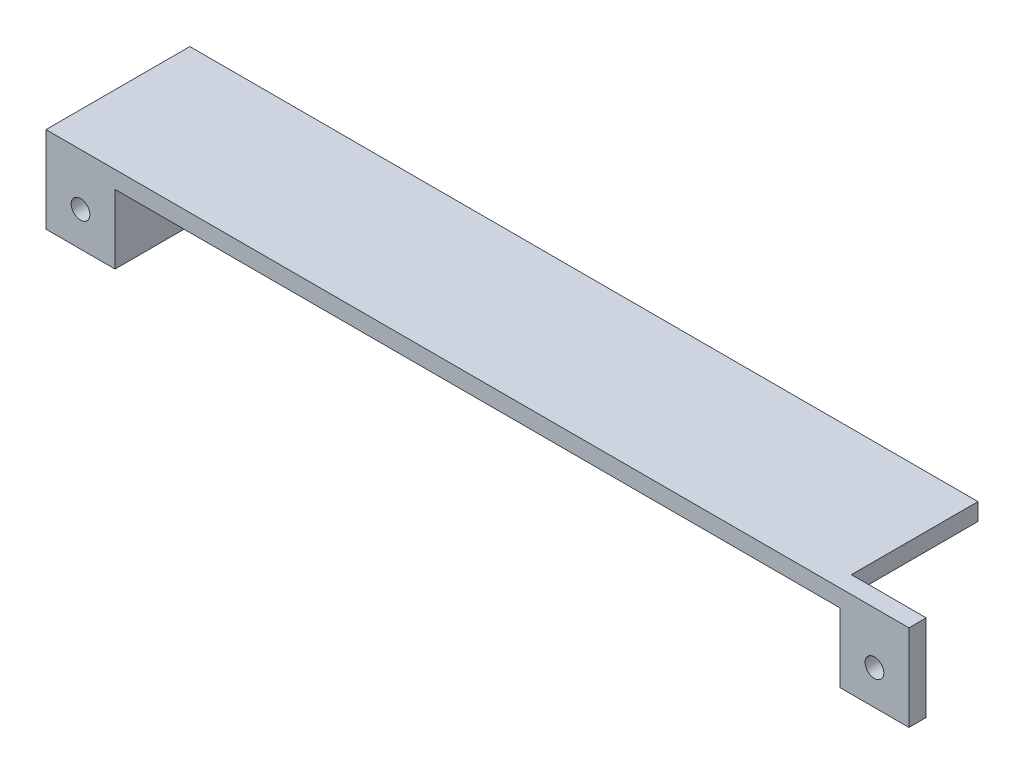
ISO-10303-21;
HEADER;
FILE_DESCRIPTION(('STEP AP214'),'2;1');
FILE_NAME('part.step','',(''),(''),'','','');
FILE_SCHEMA(('AUTOMOTIVE_DESIGN { 1 0 10303 214 1 1 1 1 }'));
ENDSEC;
DATA;
#1=APPLICATION_CONTEXT('core data for automotive mechanical design processes');
#2=APPLICATION_PROTOCOL_DEFINITION('international standard','automotive_design',2000,#1);
#3=PRODUCT_CONTEXT('',#1,'mechanical');
#4=PRODUCT('Part','Part','',(#3));
#5=PRODUCT_RELATED_PRODUCT_CATEGORY('part','',(#4));
#6=PRODUCT_DEFINITION_FORMATION('','',#4);
#7=PRODUCT_DEFINITION_CONTEXT('part definition',#1,'design');
#8=PRODUCT_DEFINITION('design','',#6,#7);
#9=PRODUCT_DEFINITION_SHAPE('','',#8);
#10=(LENGTH_UNIT() NAMED_UNIT(*) SI_UNIT(.MILLI.,.METRE.));
#11=(NAMED_UNIT(*) PLANE_ANGLE_UNIT() SI_UNIT($,.RADIAN.));
#12=(NAMED_UNIT(*) SI_UNIT($,.STERADIAN.) SOLID_ANGLE_UNIT());
#13=UNCERTAINTY_MEASURE_WITH_UNIT(LENGTH_MEASURE(1.E-05),#10,'distance_accuracy_value','');
#14=(GEOMETRIC_REPRESENTATION_CONTEXT(3) GLOBAL_UNCERTAINTY_ASSIGNED_CONTEXT((#13)) GLOBAL_UNIT_ASSIGNED_CONTEXT((#10,
#11,#12)) REPRESENTATION_CONTEXT('',''));
#15=CARTESIAN_POINT('',(0.,0.,0.));
#16=DIRECTION('',(0.,0.,1.));
#17=DIRECTION('',(1.,0.,0.));
#18=AXIS2_PLACEMENT_3D('',#15,#16,#17);
#19=CARTESIAN_POINT('',(0.,0.,0.));
#20=DIRECTION('',(0.,-1.,0.));
#21=DIRECTION('',(0.,0.,-1.));
#22=AXIS2_PLACEMENT_3D('',#19,#20,#21);
#23=PLANE('',#22);
#24=DIRECTION('',(-1.,0.,0.));
#25=VECTOR('',#24,1.);
#26=CARTESIAN_POINT('',(0.,0.,-2.99999999999998));
#27=LINE('',#26,#25);
#28=CARTESIAN_POINT('',(138.,0.,-3.));
#29=VERTEX_POINT('',#28);
#30=CARTESIAN_POINT('',(137.,0.,-3.));
#31=VERTEX_POINT('',#30);
#32=EDGE_CURVE('E211',#29,#31,#27,.T.);
#33=ORIENTED_EDGE('',*,*,#32,.F.);
#34=DIRECTION('',(0.,0.,-1.));
#35=VECTOR('',#34,1.);
#36=CARTESIAN_POINT('',(138.,0.,0.));
#37=LINE('',#36,#35);
#38=CARTESIAN_POINT('',(138.,0.,0.));
#39=VERTEX_POINT('',#38);
#40=EDGE_CURVE('E172',#39,#29,#37,.T.);
#41=ORIENTED_EDGE('',*,*,#40,.F.);
#42=DIRECTION('',(1.,0.,0.));
#43=VECTOR('',#42,1.);
#44=CARTESIAN_POINT('',(0.,0.,0.));
#45=LINE('',#44,#43);
#46=CARTESIAN_POINT('',(12.,0.,0.));
#47=VERTEX_POINT('',#46);
#48=EDGE_CURVE('E147',#47,#39,#45,.T.);
#49=ORIENTED_EDGE('',*,*,#48,.F.);
#50=DIRECTION('',(0.,0.,1.));
#51=VECTOR('',#50,1.);
#52=CARTESIAN_POINT('',(12.,0.,0.));
#53=LINE('',#52,#51);
#54=CARTESIAN_POINT('',(12.,0.,-25.));
#55=VERTEX_POINT('',#54);
#56=EDGE_CURVE('E180',#55,#47,#53,.T.);
#57=ORIENTED_EDGE('',*,*,#56,.F.);
#58=DIRECTION('',(-1.,0.,0.));
#59=VECTOR('',#58,1.);
#60=CARTESIAN_POINT('',(0.,0.,-25.));
#61=LINE('',#60,#59);
#62=CARTESIAN_POINT('',(137.,0.,-25.));
#63=VERTEX_POINT('',#62);
#64=EDGE_CURVE('E62',#63,#55,#61,.T.);
#65=ORIENTED_EDGE('',*,*,#64,.F.);
#66=DIRECTION('',(0.,0.,-1.));
#67=VECTOR('',#66,1.);
#68=CARTESIAN_POINT('',(137.,0.,0.));
#69=LINE('',#68,#67);
#70=EDGE_CURVE('E123',#31,#63,#69,.T.);
#71=ORIENTED_EDGE('',*,*,#70,.F.);
#72=EDGE_LOOP('',(#33,#41,#49,#57,#65,#71));
#73=FACE_BOUND('',#72,.T.);
#74=ADVANCED_FACE('F38',(#73),#23,.T.);
#75=CARTESIAN_POINT('',(0.,3.,0.));
#76=DIRECTION('',(1.,0.,0.));
#77=DIRECTION('',(0.,0.,-1.));
#78=AXIS2_PLACEMENT_3D('',#75,#76,#77);
#79=PLANE('',#78);
#80=DIRECTION('',(0.,-1.,0.));
#81=VECTOR('',#80,1.);
#82=CARTESIAN_POINT('',(0.,3.,-25.));
#83=LINE('',#82,#81);
#84=CARTESIAN_POINT('',(0.,3.,-25.));
#85=VERTEX_POINT('',#84);
#86=CARTESIAN_POINT('',(0.,-12.,-25.));
#87=VERTEX_POINT('',#86);
#88=EDGE_CURVE('E138',#85,#87,#83,.T.);
#89=ORIENTED_EDGE('',*,*,#88,.T.);
#90=DIRECTION('',(0.,0.,-1.));
#91=VECTOR('',#90,1.);
#92=CARTESIAN_POINT('',(0.,-12.,0.));
#93=LINE('',#92,#91);
#94=CARTESIAN_POINT('',(0.,-12.,0.));
#95=VERTEX_POINT('',#94);
#96=EDGE_CURVE('E181',#95,#87,#93,.T.);
#97=ORIENTED_EDGE('',*,*,#96,.F.);
#98=DIRECTION('',(0.,-1.,0.));
#99=VECTOR('',#98,1.);
#100=CARTESIAN_POINT('',(0.,3.,0.));
#101=LINE('',#100,#99);
#102=CARTESIAN_POINT('',(0.,3.,0.));
#103=VERTEX_POINT('',#102);
#104=EDGE_CURVE('E11',#103,#95,#101,.T.);
#105=ORIENTED_EDGE('',*,*,#104,.F.);
#106=DIRECTION('',(0.,0.,1.));
#107=VECTOR('',#106,1.);
#108=CARTESIAN_POINT('',(0.,3.,0.));
#109=LINE('',#108,#107);
#110=EDGE_CURVE('E151',#85,#103,#109,.T.);
#111=ORIENTED_EDGE('',*,*,#110,.F.);
#112=EDGE_LOOP('',(#89,#97,#105,#111));
#113=FACE_BOUND('',#112,.T.);
#114=ADVANCED_FACE('F40',(#113),#79,.F.);
#115=CARTESIAN_POINT('',(0.,3.,0.));
#116=DIRECTION('',(0.,0.,-1.));
#117=DIRECTION('',(-1.,0.,0.));
#118=AXIS2_PLACEMENT_3D('',#115,#116,#117);
#119=PLANE('',#118);
#120=CARTESIAN_POINT('',(6.,-6.,0.));
#121=DIRECTION('',(0.,0.,1.));
#122=DIRECTION('',(1.,0.,0.));
#123=AXIS2_PLACEMENT_3D('',#120,#121,#122);
#124=CIRCLE('',#123,1.625);
#125=CARTESIAN_POINT('',(7.625,-6.,0.));
#126=VERTEX_POINT('',#125);
#127=EDGE_CURVE('E228',#126,#126,#124,.T.);
#128=ORIENTED_EDGE('',*,*,#127,.F.);
#129=EDGE_LOOP('',(#128));
#130=FACE_BOUND('',#129,.T.);
#131=CARTESIAN_POINT('',(144.,-5.99999999999998,0.));
#132=DIRECTION('',(0.,0.,1.));
#133=DIRECTION('',(-1.,0.,0.));
#134=AXIS2_PLACEMENT_3D('',#131,#132,#133);
#135=CIRCLE('',#134,1.62499999999998);
#136=CARTESIAN_POINT('',(142.375,-5.99999999999998,0.));
#137=VERTEX_POINT('',#136);
#138=EDGE_CURVE('E225',#137,#137,#135,.T.);
#139=ORIENTED_EDGE('',*,*,#138,.F.);
#140=EDGE_LOOP('',(#139));
#141=FACE_BOUND('',#140,.T.);
#142=ORIENTED_EDGE('',*,*,#104,.T.);
#143=DIRECTION('',(-1.,0.,0.));
#144=VECTOR('',#143,1.);
#145=CARTESIAN_POINT('',(0.,-12.,0.));
#146=LINE('',#145,#144);
#147=CARTESIAN_POINT('',(12.,-12.,0.));
#148=VERTEX_POINT('',#147);
#149=EDGE_CURVE('E188',#148,#95,#146,.T.);
#150=ORIENTED_EDGE('',*,*,#149,.F.);
#151=DIRECTION('',(0.,1.,0.));
#152=VECTOR('',#151,1.);
#153=CARTESIAN_POINT('',(12.,-12.,0.));
#154=LINE('',#153,#152);
#155=EDGE_CURVE('E191',#148,#47,#154,.T.);
#156=ORIENTED_EDGE('',*,*,#155,.T.);
#157=ORIENTED_EDGE('',*,*,#48,.T.);
#158=DIRECTION('',(0.,1.,0.));
#159=VECTOR('',#158,1.);
#160=CARTESIAN_POINT('',(138.,-12.,0.));
#161=LINE('',#160,#159);
#162=CARTESIAN_POINT('',(138.,-12.,0.));
#163=VERTEX_POINT('',#162);
#164=EDGE_CURVE('E165',#163,#39,#161,.T.);
#165=ORIENTED_EDGE('',*,*,#164,.F.);
#166=DIRECTION('',(-1.,0.,0.));
#167=VECTOR('',#166,1.);
#168=CARTESIAN_POINT('',(150.,-12.,0.));
#169=LINE('',#168,#167);
#170=CARTESIAN_POINT('',(150.,-12.,0.));
#171=VERTEX_POINT('',#170);
#172=EDGE_CURVE('E163',#171,#163,#169,.T.);
#173=ORIENTED_EDGE('',*,*,#172,.F.);
#174=DIRECTION('',(0.,-1.,0.));
#175=VECTOR('',#174,1.);
#176=CARTESIAN_POINT('',(150.,3.,0.));
#177=LINE('',#176,#175);
#178=CARTESIAN_POINT('',(150.,3.,0.));
#179=VERTEX_POINT('',#178);
#180=EDGE_CURVE('E47',#179,#171,#177,.T.);
#181=ORIENTED_EDGE('',*,*,#180,.F.);
#182=DIRECTION('',(1.,0.,0.));
#183=VECTOR('',#182,1.);
#184=CARTESIAN_POINT('',(0.,3.,0.));
#185=LINE('',#184,#183);
#186=EDGE_CURVE('E143',#103,#179,#185,.T.);
#187=ORIENTED_EDGE('',*,*,#186,.F.);
#188=EDGE_LOOP('',(#142,#150,#156,#157,#165,#173,#181,#187));
#189=FACE_BOUND('',#188,.T.);
#190=ADVANCED_FACE('F164',(#130,#141,#189),#119,.F.);
#191=CARTESIAN_POINT('',(150.,3.,0.));
#192=DIRECTION('',(-1.,0.,0.));
#193=DIRECTION('',(0.,0.,1.));
#194=AXIS2_PLACEMENT_3D('',#191,#192,#193);
#195=PLANE('',#194);
#196=DIRECTION('',(0.,0.,1.));
#197=VECTOR('',#196,1.);
#198=CARTESIAN_POINT('',(150.,-12.,0.));
#199=LINE('',#198,#197);
#200=CARTESIAN_POINT('',(150.,-12.,-3.));
#201=VERTEX_POINT('',#200);
#202=EDGE_CURVE('E160',#201,#171,#199,.T.);
#203=ORIENTED_EDGE('',*,*,#202,.F.);
#204=DIRECTION('',(0.,1.,0.));
#205=VECTOR('',#204,1.);
#206=CARTESIAN_POINT('',(150.,-12.,-3.));
#207=LINE('',#206,#205);
#208=CARTESIAN_POINT('',(150.,3.,-3.));
#209=VERTEX_POINT('',#208);
#210=EDGE_CURVE('E54',#201,#209,#207,.T.);
#211=ORIENTED_EDGE('',*,*,#210,.T.);
#212=DIRECTION('',(0.,0.,-1.));
#213=VECTOR('',#212,1.);
#214=CARTESIAN_POINT('',(150.,3.,0.));
#215=LINE('',#214,#213);
#216=EDGE_CURVE('E140',#179,#209,#215,.T.);
#217=ORIENTED_EDGE('',*,*,#216,.F.);
#218=ORIENTED_EDGE('',*,*,#180,.T.);
#219=EDGE_LOOP('',(#203,#211,#217,#218));
#220=FACE_BOUND('',#219,.T.);
#221=ADVANCED_FACE('F159',(#220),#195,.F.);
#222=CARTESIAN_POINT('',(0.,3.,-25.));
#223=DIRECTION('',(0.,0.,1.));
#224=DIRECTION('',(1.,0.,0.));
#225=AXIS2_PLACEMENT_3D('',#222,#223,#224);
#226=PLANE('',#225);
#227=CARTESIAN_POINT('',(6.,-6.,-25.));
#228=DIRECTION('',(0.,0.,1.));
#229=DIRECTION('',(1.,0.,0.));
#230=AXIS2_PLACEMENT_3D('',#227,#228,#229);
#231=CIRCLE('',#230,1.625);
#232=CARTESIAN_POINT('',(7.625,-6.,-25.));
#233=VERTEX_POINT('',#232);
#234=EDGE_CURVE('E178',#233,#233,#231,.T.);
#235=ORIENTED_EDGE('',*,*,#234,.T.);
#236=EDGE_LOOP('',(#235));
#237=FACE_BOUND('',#236,.T.);
#238=DIRECTION('',(-1.,0.,0.));
#239=VECTOR('',#238,1.);
#240=CARTESIAN_POINT('',(0.,3.,-25.));
#241=LINE('',#240,#239);
#242=CARTESIAN_POINT('',(137.,3.,-25.));
#243=VERTEX_POINT('',#242);
#244=EDGE_CURVE('E132',#243,#85,#241,.T.);
#245=ORIENTED_EDGE('',*,*,#244,.F.);
#246=DIRECTION('',(0.,1.,0.));
#247=VECTOR('',#246,1.);
#248=CARTESIAN_POINT('',(137.,-12.,-25.));
#249=LINE('',#248,#247);
#250=EDGE_CURVE('E116',#63,#243,#249,.T.);
#251=ORIENTED_EDGE('',*,*,#250,.F.);
#252=ORIENTED_EDGE('',*,*,#64,.T.);
#253=DIRECTION('',(0.,1.,0.));
#254=VECTOR('',#253,1.);
#255=CARTESIAN_POINT('',(12.,-12.,-25.));
#256=LINE('',#255,#254);
#257=CARTESIAN_POINT('',(12.,-12.,-25.));
#258=VERTEX_POINT('',#257);
#259=EDGE_CURVE('E150',#258,#55,#256,.T.);
#260=ORIENTED_EDGE('',*,*,#259,.F.);
#261=DIRECTION('',(1.,0.,0.));
#262=VECTOR('',#261,1.);
#263=CARTESIAN_POINT('',(0.,-12.,-25.));
#264=LINE('',#263,#262);
#265=EDGE_CURVE('E184',#87,#258,#264,.T.);
#266=ORIENTED_EDGE('',*,*,#265,.F.);
#267=ORIENTED_EDGE('',*,*,#88,.F.);
#268=EDGE_LOOP('',(#245,#251,#252,#260,#266,#267));
#269=FACE_BOUND('',#268,.T.);
#270=ADVANCED_FACE('F136',(#237,#269),#226,.F.);
#271=CARTESIAN_POINT('',(0.,3.,0.));
#272=DIRECTION('',(0.,-1.,0.));
#273=DIRECTION('',(0.,0.,-1.));
#274=AXIS2_PLACEMENT_3D('',#271,#272,#273);
#275=PLANE('',#274);
#276=ORIENTED_EDGE('',*,*,#216,.T.);
#277=DIRECTION('',(1.,0.,0.));
#278=VECTOR('',#277,1.);
#279=CARTESIAN_POINT('',(150.,3.,-3.));
#280=LINE('',#279,#278);
#281=CARTESIAN_POINT('',(137.,3.,-3.));
#282=VERTEX_POINT('',#281);
#283=EDGE_CURVE('E134',#282,#209,#280,.T.);
#284=ORIENTED_EDGE('',*,*,#283,.F.);
#285=DIRECTION('',(0.,0.,1.));
#286=VECTOR('',#285,1.);
#287=CARTESIAN_POINT('',(137.,3.,-3.));
#288=LINE('',#287,#286);
#289=EDGE_CURVE('E120',#243,#282,#288,.T.);
#290=ORIENTED_EDGE('',*,*,#289,.F.);
#291=ORIENTED_EDGE('',*,*,#244,.T.);
#292=ORIENTED_EDGE('',*,*,#110,.T.);
#293=ORIENTED_EDGE('',*,*,#186,.T.);
#294=EDGE_LOOP('',(#276,#284,#290,#291,#292,#293));
#295=FACE_BOUND('',#294,.T.);
#296=ADVANCED_FACE('F130',(#295),#275,.F.);
#297=CARTESIAN_POINT('',(12.,-12.,0.));
#298=DIRECTION('',(-1.,0.,0.));
#299=DIRECTION('',(0.,0.,1.));
#300=AXIS2_PLACEMENT_3D('',#297,#298,#299);
#301=PLANE('',#300);
#302=ORIENTED_EDGE('',*,*,#56,.T.);
#303=ORIENTED_EDGE('',*,*,#155,.F.);
#304=DIRECTION('',(0.,0.,1.));
#305=VECTOR('',#304,1.);
#306=CARTESIAN_POINT('',(12.,-12.,0.));
#307=LINE('',#306,#305);
#308=EDGE_CURVE('E186',#258,#148,#307,.T.);
#309=ORIENTED_EDGE('',*,*,#308,.F.);
#310=ORIENTED_EDGE('',*,*,#259,.T.);
#311=EDGE_LOOP('',(#302,#303,#309,#310));
#312=FACE_BOUND('',#311,.T.);
#313=ADVANCED_FACE('F207',(#312),#301,.F.);
#314=CARTESIAN_POINT('',(0.,-12.,0.));
#315=DIRECTION('',(0.,-1.,0.));
#316=DIRECTION('',(0.,0.,-1.));
#317=AXIS2_PLACEMENT_3D('',#314,#315,#316);
#318=PLANE('',#317);
#319=ORIENTED_EDGE('',*,*,#96,.T.);
#320=ORIENTED_EDGE('',*,*,#265,.T.);
#321=ORIENTED_EDGE('',*,*,#308,.T.);
#322=ORIENTED_EDGE('',*,*,#149,.T.);
#323=EDGE_LOOP('',(#319,#320,#321,#322));
#324=FACE_BOUND('',#323,.T.);
#325=ADVANCED_FACE('F203',(#324),#318,.T.);
#326=CARTESIAN_POINT('',(138.,-12.,0.));
#327=DIRECTION('',(1.,0.,0.));
#328=DIRECTION('',(0.,0.,-1.));
#329=AXIS2_PLACEMENT_3D('',#326,#327,#328);
#330=PLANE('',#329);
#331=ORIENTED_EDGE('',*,*,#40,.T.);
#332=DIRECTION('',(0.,-1.,0.));
#333=VECTOR('',#332,1.);
#334=CARTESIAN_POINT('',(138.,-12.,-3.));
#335=LINE('',#334,#333);
#336=CARTESIAN_POINT('',(138.,-12.,-3.));
#337=VERTEX_POINT('',#336);
#338=EDGE_CURVE('E215',#29,#337,#335,.T.);
#339=ORIENTED_EDGE('',*,*,#338,.T.);
#340=DIRECTION('',(0.,0.,-1.));
#341=VECTOR('',#340,1.);
#342=CARTESIAN_POINT('',(138.,-12.,0.));
#343=LINE('',#342,#341);
#344=EDGE_CURVE('E169',#163,#337,#343,.T.);
#345=ORIENTED_EDGE('',*,*,#344,.F.);
#346=ORIENTED_EDGE('',*,*,#164,.T.);
#347=EDGE_LOOP('',(#331,#339,#345,#346));
#348=FACE_BOUND('',#347,.T.);
#349=ADVANCED_FACE('F214',(#348),#330,.F.);
#350=CARTESIAN_POINT('',(0.,-12.,0.));
#351=DIRECTION('',(0.,1.,0.));
#352=DIRECTION('',(0.,0.,1.));
#353=AXIS2_PLACEMENT_3D('',#350,#351,#352);
#354=PLANE('',#353);
#355=ORIENTED_EDGE('',*,*,#344,.T.);
#356=DIRECTION('',(1.,0.,0.));
#357=VECTOR('',#356,1.);
#358=CARTESIAN_POINT('',(150.,-12.,-3.));
#359=LINE('',#358,#357);
#360=EDGE_CURVE('E126',#337,#201,#359,.T.);
#361=ORIENTED_EDGE('',*,*,#360,.T.);
#362=ORIENTED_EDGE('',*,*,#202,.T.);
#363=ORIENTED_EDGE('',*,*,#172,.T.);
#364=EDGE_LOOP('',(#355,#361,#362,#363));
#365=FACE_BOUND('',#364,.T.);
#366=ADVANCED_FACE('F216',(#365),#354,.F.);
#367=CARTESIAN_POINT('',(144.,-5.99999999999998,-25.));
#368=DIRECTION('',(0.,0.,1.));
#369=DIRECTION('',(1.,0.,0.));
#370=AXIS2_PLACEMENT_3D('',#367,#368,#369);
#371=CYLINDRICAL_SURFACE('',#370,1.62499999999998);
#372=CARTESIAN_POINT('',(144.,-5.99999999999998,-3.));
#373=DIRECTION('',(0.,0.,1.));
#374=DIRECTION('',(1.,0.,0.));
#375=AXIS2_PLACEMENT_3D('',#372,#373,#374);
#376=CIRCLE('',#375,1.62499999999998);
#377=CARTESIAN_POINT('',(145.625,-5.99999999999998,-3.));
#378=VERTEX_POINT('',#377);
#379=EDGE_CURVE('E42',#378,#378,#376,.F.);
#380=ORIENTED_EDGE('',*,*,#379,.T.);
#381=EDGE_LOOP('',(#380));
#382=FACE_BOUND('',#381,.T.);
#383=ORIENTED_EDGE('',*,*,#138,.T.);
#384=EDGE_LOOP('',(#383));
#385=FACE_BOUND('',#384,.T.);
#386=ADVANCED_FACE('F233',(#382,#385),#371,.F.);
#387=CARTESIAN_POINT('',(6.,-6.,-25.));
#388=DIRECTION('',(0.,0.,1.));
#389=DIRECTION('',(1.,0.,0.));
#390=AXIS2_PLACEMENT_3D('',#387,#388,#389);
#391=CYLINDRICAL_SURFACE('',#390,1.625);
#392=ORIENTED_EDGE('',*,*,#234,.F.);
#393=EDGE_LOOP('',(#392));
#394=FACE_BOUND('',#393,.T.);
#395=ORIENTED_EDGE('',*,*,#127,.T.);
#396=EDGE_LOOP('',(#395));
#397=FACE_BOUND('',#396,.T.);
#398=ADVANCED_FACE('F259',(#394,#397),#391,.F.);
#399=CARTESIAN_POINT('',(150.,-12.,-3.));
#400=DIRECTION('',(0.,0.,1.));
#401=DIRECTION('',(1.,0.,0.));
#402=AXIS2_PLACEMENT_3D('',#399,#400,#401);
#403=PLANE('',#402);
#404=ORIENTED_EDGE('',*,*,#32,.T.);
#405=DIRECTION('',(0.,1.,0.));
#406=VECTOR('',#405,1.);
#407=CARTESIAN_POINT('',(137.,-12.,-3.));
#408=LINE('',#407,#406);
#409=EDGE_CURVE('E125',#31,#282,#408,.T.);
#410=ORIENTED_EDGE('',*,*,#409,.T.);
#411=ORIENTED_EDGE('',*,*,#283,.T.);
#412=ORIENTED_EDGE('',*,*,#210,.F.);
#413=ORIENTED_EDGE('',*,*,#360,.F.);
#414=ORIENTED_EDGE('',*,*,#338,.F.);
#415=EDGE_LOOP('',(#404,#410,#411,#412,#413,#414));
#416=FACE_BOUND('',#415,.T.);
#417=ORIENTED_EDGE('',*,*,#379,.F.);
#418=EDGE_LOOP('',(#417));
#419=FACE_BOUND('',#418,.T.);
#420=ADVANCED_FACE('F262',(#416,#419),#403,.F.);
#421=CARTESIAN_POINT('',(137.,-12.,-3.));
#422=DIRECTION('',(-1.,0.,0.));
#423=DIRECTION('',(0.,0.,1.));
#424=AXIS2_PLACEMENT_3D('',#421,#422,#423);
#425=PLANE('',#424);
#426=ORIENTED_EDGE('',*,*,#70,.T.);
#427=ORIENTED_EDGE('',*,*,#250,.T.);
#428=ORIENTED_EDGE('',*,*,#289,.T.);
#429=ORIENTED_EDGE('',*,*,#409,.F.);
#430=EDGE_LOOP('',(#426,#427,#428,#429));
#431=FACE_BOUND('',#430,.T.);
#432=ADVANCED_FACE('F118',(#431),#425,.F.);
#433=CLOSED_SHELL('',(#74,#114,#190,#221,#270,#296,#313,#325,#349,#366,#386,#398,#420,#432));
#434=MANIFOLD_SOLID_BREP('B2',#433);
#435=ADVANCED_BREP_SHAPE_REPRESENTATION('',(#18,#434),#14);
#436=SHAPE_DEFINITION_REPRESENTATION(#9,#435);
ENDSEC;
END-ISO-10303-21;
